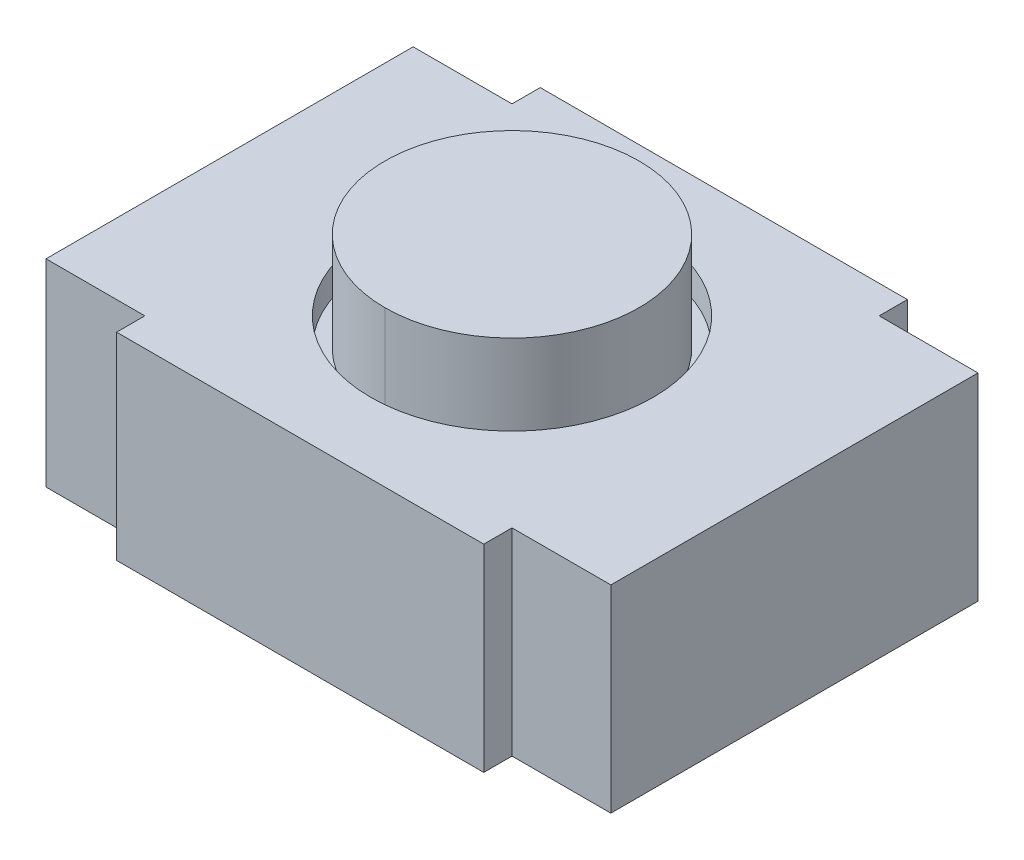
ISO-10303-21;
HEADER;
FILE_DESCRIPTION(('STEP AP214'),'2;1');
FILE_NAME('part.step','',(''),(''),'','','');
FILE_SCHEMA(('AUTOMOTIVE_DESIGN { 1 0 10303 214 1 1 1 1 }'));
ENDSEC;
DATA;
#1=APPLICATION_CONTEXT('core data for automotive mechanical design processes');
#2=APPLICATION_PROTOCOL_DEFINITION('international standard','automotive_design',2000,#1);
#3=PRODUCT_CONTEXT('',#1,'mechanical');
#4=PRODUCT('Part','Part','',(#3));
#5=PRODUCT_RELATED_PRODUCT_CATEGORY('part','',(#4));
#6=PRODUCT_DEFINITION_FORMATION('','',#4);
#7=PRODUCT_DEFINITION_CONTEXT('part definition',#1,'design');
#8=PRODUCT_DEFINITION('design','',#6,#7);
#9=PRODUCT_DEFINITION_SHAPE('','',#8);
#10=(LENGTH_UNIT() NAMED_UNIT(*) SI_UNIT(.MILLI.,.METRE.));
#11=(NAMED_UNIT(*) PLANE_ANGLE_UNIT() SI_UNIT($,.RADIAN.));
#12=(NAMED_UNIT(*) SI_UNIT($,.STERADIAN.) SOLID_ANGLE_UNIT());
#13=UNCERTAINTY_MEASURE_WITH_UNIT(LENGTH_MEASURE(1.E-05),#10,'distance_accuracy_value','');
#14=(GEOMETRIC_REPRESENTATION_CONTEXT(3) GLOBAL_UNCERTAINTY_ASSIGNED_CONTEXT((#13)) GLOBAL_UNIT_ASSIGNED_CONTEXT((#10,
#11,#12)) REPRESENTATION_CONTEXT('',''));
#15=CARTESIAN_POINT('',(0.,0.,0.));
#16=DIRECTION('',(0.,0.,1.));
#17=DIRECTION('',(1.,0.,0.));
#18=AXIS2_PLACEMENT_3D('',#15,#16,#17);
#19=CARTESIAN_POINT('',(0.,-1.2,0.));
#20=DIRECTION('',(0.,1.,0.));
#21=DIRECTION('',(1.,0.,0.));
#22=AXIS2_PLACEMENT_3D('',#19,#20,#21);
#23=PLANE('',#22);
#24=DIRECTION('',(0.,0.,-1.));
#25=VECTOR('',#24,1.);
#26=CARTESIAN_POINT('',(2.,-1.2,-1.3));
#27=LINE('',#26,#25);
#28=CARTESIAN_POINT('',(2.,-1.2,1.3));
#29=VERTEX_POINT('',#28);
#30=CARTESIAN_POINT('',(2.,-1.2,-1.3));
#31=VERTEX_POINT('',#30);
#32=EDGE_CURVE('E26',#29,#31,#27,.T.);
#33=ORIENTED_EDGE('',*,*,#32,.F.);
#34=DIRECTION('',(1.,0.,0.));
#35=VECTOR('',#34,1.);
#36=CARTESIAN_POINT('',(-2.,-1.2,1.3));
#37=LINE('',#36,#35);
#38=CARTESIAN_POINT('',(1.3,-1.2,1.3));
#39=VERTEX_POINT('',#38);
#40=EDGE_CURVE('E11',#39,#29,#37,.T.);
#41=ORIENTED_EDGE('',*,*,#40,.F.);
#42=DIRECTION('',(0.,0.,-1.));
#43=VECTOR('',#42,1.);
#44=CARTESIAN_POINT('',(1.3,-1.2,1.5));
#45=LINE('',#44,#43);
#46=CARTESIAN_POINT('',(1.3,-1.2,1.5));
#47=VERTEX_POINT('',#46);
#48=EDGE_CURVE('E164',#47,#39,#45,.T.);
#49=ORIENTED_EDGE('',*,*,#48,.F.);
#50=DIRECTION('',(1.,0.,0.));
#51=VECTOR('',#50,1.);
#52=CARTESIAN_POINT('',(-1.3,-1.2,1.5));
#53=LINE('',#52,#51);
#54=CARTESIAN_POINT('',(-1.3,-1.2,1.5));
#55=VERTEX_POINT('',#54);
#56=EDGE_CURVE('E126',#55,#47,#53,.T.);
#57=ORIENTED_EDGE('',*,*,#56,.F.);
#58=DIRECTION('',(0.,0.,1.));
#59=VECTOR('',#58,1.);
#60=CARTESIAN_POINT('',(-1.3,-1.2,1.5));
#61=LINE('',#60,#59);
#62=CARTESIAN_POINT('',(-1.3,-1.2,1.3));
#63=VERTEX_POINT('',#62);
#64=EDGE_CURVE('E143',#63,#55,#61,.T.);
#65=ORIENTED_EDGE('',*,*,#64,.F.);
#66=DIRECTION('',(1.,0.,0.));
#67=VECTOR('',#66,1.);
#68=CARTESIAN_POINT('',(-2.,-1.2,1.3));
#69=LINE('',#68,#67);
#70=CARTESIAN_POINT('',(-2.,-1.2,1.3));
#71=VERTEX_POINT('',#70);
#72=EDGE_CURVE('E157',#71,#63,#69,.T.);
#73=ORIENTED_EDGE('',*,*,#72,.F.);
#74=DIRECTION('',(0.,0.,1.));
#75=VECTOR('',#74,1.);
#76=CARTESIAN_POINT('',(-2.,-1.2,-1.3));
#77=LINE('',#76,#75);
#78=CARTESIAN_POINT('',(-2.,-1.2,-1.3));
#79=VERTEX_POINT('',#78);
#80=EDGE_CURVE('E155',#79,#71,#77,.T.);
#81=ORIENTED_EDGE('',*,*,#80,.F.);
#82=DIRECTION('',(-1.,0.,0.));
#83=VECTOR('',#82,1.);
#84=CARTESIAN_POINT('',(-2.,-1.2,-1.3));
#85=LINE('',#84,#83);
#86=CARTESIAN_POINT('',(-1.3,-1.2,-1.3));
#87=VERTEX_POINT('',#86);
#88=EDGE_CURVE('E183',#87,#79,#85,.T.);
#89=ORIENTED_EDGE('',*,*,#88,.F.);
#90=DIRECTION('',(0.,0.,1.));
#91=VECTOR('',#90,1.);
#92=CARTESIAN_POINT('',(-1.3,-1.2,-1.5));
#93=LINE('',#92,#91);
#94=CARTESIAN_POINT('',(-1.3,-1.2,-1.5));
#95=VERTEX_POINT('',#94);
#96=EDGE_CURVE('E200',#95,#87,#93,.T.);
#97=ORIENTED_EDGE('',*,*,#96,.F.);
#98=DIRECTION('',(-1.,0.,0.));
#99=VECTOR('',#98,1.);
#100=CARTESIAN_POINT('',(1.3,-1.2,-1.5));
#101=LINE('',#100,#99);
#102=CARTESIAN_POINT('',(1.3,-1.2,-1.5));
#103=VERTEX_POINT('',#102);
#104=EDGE_CURVE('E190',#103,#95,#101,.T.);
#105=ORIENTED_EDGE('',*,*,#104,.F.);
#106=DIRECTION('',(0.,0.,-1.));
#107=VECTOR('',#106,1.);
#108=CARTESIAN_POINT('',(1.3,-1.2,-1.5));
#109=LINE('',#108,#107);
#110=CARTESIAN_POINT('',(1.3,-1.2,-1.3));
#111=VERTEX_POINT('',#110);
#112=EDGE_CURVE('E176',#111,#103,#109,.T.);
#113=ORIENTED_EDGE('',*,*,#112,.F.);
#114=DIRECTION('',(-1.,0.,0.));
#115=VECTOR('',#114,1.);
#116=CARTESIAN_POINT('',(-2.,-1.2,-1.3));
#117=LINE('',#116,#115);
#118=EDGE_CURVE('E19',#31,#111,#117,.T.);
#119=ORIENTED_EDGE('',*,*,#118,.F.);
#120=EDGE_LOOP('',(#33,#41,#49,#57,#65,#73,#81,#89,#97,#105,#113,#119));
#121=FACE_BOUND('',#120,.T.);
#122=ADVANCED_FACE('F16',(#121),#23,.F.);
#123=CARTESIAN_POINT('',(-2.,-1.2,1.3));
#124=DIRECTION('',(0.,0.,1.));
#125=DIRECTION('',(1.,0.,0.));
#126=AXIS2_PLACEMENT_3D('',#123,#124,#125);
#127=PLANE('',#126);
#128=DIRECTION('',(0.,1.,0.));
#129=VECTOR('',#128,1.);
#130=CARTESIAN_POINT('',(2.,-1.2,1.3));
#131=LINE('',#130,#129);
#132=CARTESIAN_POINT('',(2.,0.2,1.3));
#133=VERTEX_POINT('',#132);
#134=EDGE_CURVE('E205',#29,#133,#131,.T.);
#135=ORIENTED_EDGE('',*,*,#134,.T.);
#136=DIRECTION('',(1.,0.,0.));
#137=VECTOR('',#136,1.);
#138=CARTESIAN_POINT('',(2.,0.2,1.3));
#139=LINE('',#138,#137);
#140=CARTESIAN_POINT('',(1.3,0.2,1.3));
#141=VERTEX_POINT('',#140);
#142=EDGE_CURVE('E125',#141,#133,#139,.T.);
#143=ORIENTED_EDGE('',*,*,#142,.F.);
#144=DIRECTION('',(0.,1.,0.));
#145=VECTOR('',#144,1.);
#146=CARTESIAN_POINT('',(1.3,-3.80768096208106,1.3));
#147=LINE('',#146,#145);
#148=EDGE_CURVE('E222',#39,#141,#147,.T.);
#149=ORIENTED_EDGE('',*,*,#148,.F.);
#150=ORIENTED_EDGE('',*,*,#40,.T.);
#151=EDGE_LOOP('',(#135,#143,#149,#150));
#152=FACE_BOUND('',#151,.T.);
#153=ADVANCED_FACE('F390',(#152),#127,.T.);
#154=CARTESIAN_POINT('',(2.,-1.2,-1.3));
#155=DIRECTION('',(1.,0.,0.));
#156=DIRECTION('',(0.,0.,-1.));
#157=AXIS2_PLACEMENT_3D('',#154,#155,#156);
#158=PLANE('',#157);
#159=DIRECTION('',(0.,1.,0.));
#160=VECTOR('',#159,1.);
#161=CARTESIAN_POINT('',(2.,-1.2,-1.3));
#162=LINE('',#161,#160);
#163=CARTESIAN_POINT('',(2.,0.2,-1.3));
#164=VERTEX_POINT('',#163);
#165=EDGE_CURVE('E201',#31,#164,#162,.T.);
#166=ORIENTED_EDGE('',*,*,#165,.T.);
#167=DIRECTION('',(0.,0.,-1.));
#168=VECTOR('',#167,1.);
#169=CARTESIAN_POINT('',(2.,0.2,-1.3));
#170=LINE('',#169,#168);
#171=EDGE_CURVE('E253',#133,#164,#170,.T.);
#172=ORIENTED_EDGE('',*,*,#171,.F.);
#173=ORIENTED_EDGE('',*,*,#134,.F.);
#174=ORIENTED_EDGE('',*,*,#32,.T.);
#175=EDGE_LOOP('',(#166,#172,#173,#174));
#176=FACE_BOUND('',#175,.T.);
#177=ADVANCED_FACE('F393',(#176),#158,.T.);
#178=CARTESIAN_POINT('',(-2.,-1.2,-1.3));
#179=DIRECTION('',(0.,0.,-1.));
#180=DIRECTION('',(0.,-1.,0.));
#181=AXIS2_PLACEMENT_3D('',#178,#179,#180);
#182=PLANE('',#181);
#183=ORIENTED_EDGE('',*,*,#118,.T.);
#184=DIRECTION('',(0.,-1.,0.));
#185=VECTOR('',#184,1.);
#186=CARTESIAN_POINT('',(1.3,0.2,-1.3));
#187=LINE('',#186,#185);
#188=CARTESIAN_POINT('',(1.3,0.2,-1.3));
#189=VERTEX_POINT('',#188);
#190=EDGE_CURVE('E172',#189,#111,#187,.T.);
#191=ORIENTED_EDGE('',*,*,#190,.F.);
#192=DIRECTION('',(-1.,0.,0.));
#193=VECTOR('',#192,1.);
#194=CARTESIAN_POINT('',(1.3,0.2,-1.3));
#195=LINE('',#194,#193);
#196=EDGE_CURVE('E249',#164,#189,#195,.T.);
#197=ORIENTED_EDGE('',*,*,#196,.F.);
#198=ORIENTED_EDGE('',*,*,#165,.F.);
#199=EDGE_LOOP('',(#183,#191,#197,#198));
#200=FACE_BOUND('',#199,.T.);
#201=ADVANCED_FACE('F364',(#200),#182,.T.);
#202=CARTESIAN_POINT('',(-2.,-1.2,-1.3));
#203=DIRECTION('',(0.,0.,-1.));
#204=DIRECTION('',(0.,-1.,0.));
#205=AXIS2_PLACEMENT_3D('',#202,#203,#204);
#206=PLANE('',#205);
#207=DIRECTION('',(0.,1.,0.));
#208=VECTOR('',#207,1.);
#209=CARTESIAN_POINT('',(-2.,-1.2,-1.3));
#210=LINE('',#209,#208);
#211=CARTESIAN_POINT('',(-2.,0.2,-1.3));
#212=VERTEX_POINT('',#211);
#213=EDGE_CURVE('E152',#79,#212,#210,.T.);
#214=ORIENTED_EDGE('',*,*,#213,.T.);
#215=DIRECTION('',(-1.,0.,0.));
#216=VECTOR('',#215,1.);
#217=CARTESIAN_POINT('',(-1.3,0.2,-1.3));
#218=LINE('',#217,#216);
#219=CARTESIAN_POINT('',(-1.3,0.2,-1.3));
#220=VERTEX_POINT('',#219);
#221=EDGE_CURVE('E194',#220,#212,#218,.T.);
#222=ORIENTED_EDGE('',*,*,#221,.F.);
#223=DIRECTION('',(0.,1.,0.));
#224=VECTOR('',#223,1.);
#225=CARTESIAN_POINT('',(-1.3,-3.80768096208106,-1.3));
#226=LINE('',#225,#224);
#227=EDGE_CURVE('E195',#87,#220,#226,.T.);
#228=ORIENTED_EDGE('',*,*,#227,.F.);
#229=ORIENTED_EDGE('',*,*,#88,.T.);
#230=EDGE_LOOP('',(#214,#222,#228,#229));
#231=FACE_BOUND('',#230,.T.);
#232=ADVANCED_FACE('F377',(#231),#206,.T.);
#233=CARTESIAN_POINT('',(-2.,-1.2,-1.3));
#234=DIRECTION('',(-1.,0.,0.));
#235=DIRECTION('',(0.,1.,0.));
#236=AXIS2_PLACEMENT_3D('',#233,#234,#235);
#237=PLANE('',#236);
#238=DIRECTION('',(0.,1.,0.));
#239=VECTOR('',#238,1.);
#240=CARTESIAN_POINT('',(-2.,-1.2,1.3));
#241=LINE('',#240,#239);
#242=CARTESIAN_POINT('',(-2.,0.2,1.3));
#243=VERTEX_POINT('',#242);
#244=EDGE_CURVE('E156',#71,#243,#241,.T.);
#245=ORIENTED_EDGE('',*,*,#244,.T.);
#246=DIRECTION('',(0.,0.,1.));
#247=VECTOR('',#246,1.);
#248=CARTESIAN_POINT('',(-2.,0.2,-1.3));
#249=LINE('',#248,#247);
#250=EDGE_CURVE('E191',#212,#243,#249,.T.);
#251=ORIENTED_EDGE('',*,*,#250,.F.);
#252=ORIENTED_EDGE('',*,*,#213,.F.);
#253=ORIENTED_EDGE('',*,*,#80,.T.);
#254=EDGE_LOOP('',(#245,#251,#252,#253));
#255=FACE_BOUND('',#254,.T.);
#256=ADVANCED_FACE('F382',(#255),#237,.T.);
#257=CARTESIAN_POINT('',(-2.,-1.2,1.3));
#258=DIRECTION('',(0.,0.,1.));
#259=DIRECTION('',(1.,0.,0.));
#260=AXIS2_PLACEMENT_3D('',#257,#258,#259);
#261=PLANE('',#260);
#262=ORIENTED_EDGE('',*,*,#72,.T.);
#263=DIRECTION('',(0.,-1.,0.));
#264=VECTOR('',#263,1.);
#265=CARTESIAN_POINT('',(-1.3,0.2,1.3));
#266=LINE('',#265,#264);
#267=CARTESIAN_POINT('',(-1.3,0.2,1.3));
#268=VERTEX_POINT('',#267);
#269=EDGE_CURVE('E149',#268,#63,#266,.T.);
#270=ORIENTED_EDGE('',*,*,#269,.F.);
#271=DIRECTION('',(1.,0.,0.));
#272=VECTOR('',#271,1.);
#273=CARTESIAN_POINT('',(-2.,0.2,1.3));
#274=LINE('',#273,#272);
#275=EDGE_CURVE('E135',#243,#268,#274,.T.);
#276=ORIENTED_EDGE('',*,*,#275,.F.);
#277=ORIENTED_EDGE('',*,*,#244,.F.);
#278=EDGE_LOOP('',(#262,#270,#276,#277));
#279=FACE_BOUND('',#278,.T.);
#280=ADVANCED_FACE('F386',(#279),#261,.T.);
#281=CARTESIAN_POINT('',(0.,-1.201,0.));
#282=DIRECTION('',(0.,1.,0.));
#283=DIRECTION('',(0.,0.,1.));
#284=AXIS2_PLACEMENT_3D('',#281,#282,#283);
#285=CYLINDRICAL_SURFACE('',#284,1.);
#286=DIRECTION('',(0.,1.,0.));
#287=VECTOR('',#286,1.);
#288=CARTESIAN_POINT('',(0.,-1.201,-1.));
#289=LINE('',#288,#287);
#290=CARTESIAN_POINT('',(0.,0.,-1.));
#291=VERTEX_POINT('',#290);
#292=CARTESIAN_POINT('',(0.,0.2,-1.));
#293=VERTEX_POINT('',#292);
#294=EDGE_CURVE('E231',#291,#293,#289,.T.);
#295=ORIENTED_EDGE('',*,*,#294,.F.);
#296=CARTESIAN_POINT('',(0.,0.,0.));
#297=DIRECTION('',(0.,-1.,0.));
#298=DIRECTION('',(0.,0.,1.));
#299=AXIS2_PLACEMENT_3D('',#296,#297,#298);
#300=CIRCLE('',#299,1.);
#301=CARTESIAN_POINT('',(0.,0.,1.));
#302=VERTEX_POINT('',#301);
#303=EDGE_CURVE('E170',#291,#302,#300,.T.);
#304=ORIENTED_EDGE('',*,*,#303,.T.);
#305=DIRECTION('',(0.,1.,0.));
#306=VECTOR('',#305,1.);
#307=CARTESIAN_POINT('',(0.,-1.201,1.));
#308=LINE('',#307,#306);
#309=CARTESIAN_POINT('',(0.,0.2,1.));
#310=VERTEX_POINT('',#309);
#311=EDGE_CURVE('E244',#302,#310,#308,.T.);
#312=ORIENTED_EDGE('',*,*,#311,.T.);
#313=CARTESIAN_POINT('',(0.,0.2,0.));
#314=DIRECTION('',(0.,1.,0.));
#315=DIRECTION('',(0.,0.,1.));
#316=AXIS2_PLACEMENT_3D('',#313,#314,#315);
#317=CIRCLE('',#316,1.);
#318=EDGE_CURVE('E161',#310,#293,#317,.T.);
#319=ORIENTED_EDGE('',*,*,#318,.T.);
#320=EDGE_LOOP('',(#295,#304,#312,#319));
#321=FACE_BOUND('',#320,.T.);
#322=ADVANCED_FACE('F459',(#321),#285,.F.);
#323=CARTESIAN_POINT('',(0.,0.2,0.));
#324=DIRECTION('',(0.,1.,0.));
#325=DIRECTION('',(1.,0.,0.));
#326=AXIS2_PLACEMENT_3D('',#323,#324,#325);
#327=PLANE('',#326);
#328=ORIENTED_EDGE('',*,*,#318,.F.);
#329=CARTESIAN_POINT('',(0.,0.2,0.));
#330=DIRECTION('',(0.,1.,0.));
#331=DIRECTION('',(0.,0.,1.));
#332=AXIS2_PLACEMENT_3D('',#329,#330,#331);
#333=CIRCLE('',#332,1.);
#334=EDGE_CURVE('E235',#293,#310,#333,.T.);
#335=ORIENTED_EDGE('',*,*,#334,.F.);
#336=EDGE_LOOP('',(#328,#335));
#337=FACE_BOUND('',#336,.T.);
#338=DIRECTION('',(0.,0.,-1.));
#339=VECTOR('',#338,1.);
#340=CARTESIAN_POINT('',(1.3,0.2,1.3));
#341=LINE('',#340,#339);
#342=CARTESIAN_POINT('',(1.3,0.2,1.5));
#343=VERTEX_POINT('',#342);
#344=EDGE_CURVE('E177',#343,#141,#341,.T.);
#345=ORIENTED_EDGE('',*,*,#344,.T.);
#346=ORIENTED_EDGE('',*,*,#142,.T.);
#347=ORIENTED_EDGE('',*,*,#171,.T.);
#348=ORIENTED_EDGE('',*,*,#196,.T.);
#349=DIRECTION('',(0.,0.,-1.));
#350=VECTOR('',#349,1.);
#351=CARTESIAN_POINT('',(1.3,0.2,-1.5));
#352=LINE('',#351,#350);
#353=CARTESIAN_POINT('',(1.3,0.2,-1.5));
#354=VERTEX_POINT('',#353);
#355=EDGE_CURVE('E182',#189,#354,#352,.T.);
#356=ORIENTED_EDGE('',*,*,#355,.T.);
#357=DIRECTION('',(-1.,0.,0.));
#358=VECTOR('',#357,1.);
#359=CARTESIAN_POINT('',(-1.3,0.2,-1.5));
#360=LINE('',#359,#358);
#361=CARTESIAN_POINT('',(-1.3,0.2,-1.5));
#362=VERTEX_POINT('',#361);
#363=EDGE_CURVE('E237',#354,#362,#360,.T.);
#364=ORIENTED_EDGE('',*,*,#363,.T.);
#365=DIRECTION('',(0.,0.,1.));
#366=VECTOR('',#365,1.);
#367=CARTESIAN_POINT('',(-1.3,0.2,-1.5));
#368=LINE('',#367,#366);
#369=EDGE_CURVE('E199',#362,#220,#368,.T.);
#370=ORIENTED_EDGE('',*,*,#369,.T.);
#371=ORIENTED_EDGE('',*,*,#221,.T.);
#372=ORIENTED_EDGE('',*,*,#250,.T.);
#373=ORIENTED_EDGE('',*,*,#275,.T.);
#374=DIRECTION('',(0.,0.,1.));
#375=VECTOR('',#374,1.);
#376=CARTESIAN_POINT('',(-1.3,0.2,1.3));
#377=LINE('',#376,#375);
#378=CARTESIAN_POINT('',(-1.3,0.2,1.5));
#379=VERTEX_POINT('',#378);
#380=EDGE_CURVE('E130',#268,#379,#377,.T.);
#381=ORIENTED_EDGE('',*,*,#380,.T.);
#382=DIRECTION('',(1.,0.,0.));
#383=VECTOR('',#382,1.);
#384=CARTESIAN_POINT('',(-1.3,0.2,1.5));
#385=LINE('',#384,#383);
#386=EDGE_CURVE('E112',#379,#343,#385,.T.);
#387=ORIENTED_EDGE('',*,*,#386,.T.);
#388=EDGE_LOOP('',(#345,#346,#347,#348,#356,#364,#370,#371,#372,#373,#381,#387));
#389=FACE_BOUND('',#388,.T.);
#390=ADVANCED_FACE('F131',(#337,#389),#327,.T.);
#391=CARTESIAN_POINT('',(-1.3,0.2,1.5));
#392=DIRECTION('',(0.,0.,-1.));
#393=DIRECTION('',(0.,-1.,0.));
#394=AXIS2_PLACEMENT_3D('',#391,#392,#393);
#395=PLANE('',#394);
#396=DIRECTION('',(0.,-1.,0.));
#397=VECTOR('',#396,1.);
#398=CARTESIAN_POINT('',(-1.3,0.2,1.5));
#399=LINE('',#398,#397);
#400=EDGE_CURVE('E117',#379,#55,#399,.T.);
#401=ORIENTED_EDGE('',*,*,#400,.T.);
#402=ORIENTED_EDGE('',*,*,#56,.T.);
#403=DIRECTION('',(0.,-1.,0.));
#404=VECTOR('',#403,1.);
#405=CARTESIAN_POINT('',(1.3,0.2,1.5));
#406=LINE('',#405,#404);
#407=EDGE_CURVE('E120',#343,#47,#406,.T.);
#408=ORIENTED_EDGE('',*,*,#407,.F.);
#409=ORIENTED_EDGE('',*,*,#386,.F.);
#410=EDGE_LOOP('',(#401,#402,#408,#409));
#411=FACE_BOUND('',#410,.T.);
#412=ADVANCED_FACE('F114',(#411),#395,.F.);
#413=CARTESIAN_POINT('',(-1.3,0.2,1.3));
#414=DIRECTION('',(1.,0.,0.));
#415=DIRECTION('',(0.,0.,1.));
#416=AXIS2_PLACEMENT_3D('',#413,#414,#415);
#417=PLANE('',#416);
#418=ORIENTED_EDGE('',*,*,#269,.T.);
#419=ORIENTED_EDGE('',*,*,#64,.T.);
#420=ORIENTED_EDGE('',*,*,#400,.F.);
#421=ORIENTED_EDGE('',*,*,#380,.F.);
#422=EDGE_LOOP('',(#418,#419,#420,#421));
#423=FACE_BOUND('',#422,.T.);
#424=ADVANCED_FACE('F141',(#423),#417,.F.);
#425=CARTESIAN_POINT('',(-1.3,0.2,-1.5));
#426=DIRECTION('',(1.,0.,0.));
#427=DIRECTION('',(0.,0.,-1.));
#428=AXIS2_PLACEMENT_3D('',#425,#426,#427);
#429=PLANE('',#428);
#430=DIRECTION('',(0.,-1.,0.));
#431=VECTOR('',#430,1.);
#432=CARTESIAN_POINT('',(-1.3,0.2,-1.5));
#433=LINE('',#432,#431);
#434=EDGE_CURVE('E216',#362,#95,#433,.T.);
#435=ORIENTED_EDGE('',*,*,#434,.T.);
#436=ORIENTED_EDGE('',*,*,#96,.T.);
#437=ORIENTED_EDGE('',*,*,#227,.T.);
#438=ORIENTED_EDGE('',*,*,#369,.F.);
#439=EDGE_LOOP('',(#435,#436,#437,#438));
#440=FACE_BOUND('',#439,.T.);
#441=ADVANCED_FACE('F375',(#440),#429,.F.);
#442=CARTESIAN_POINT('',(-1.3,0.2,-1.5));
#443=DIRECTION('',(0.,0.,1.));
#444=DIRECTION('',(1.,0.,0.));
#445=AXIS2_PLACEMENT_3D('',#442,#443,#444);
#446=PLANE('',#445);
#447=DIRECTION('',(0.,-1.,0.));
#448=VECTOR('',#447,1.);
#449=CARTESIAN_POINT('',(1.3,0.2,-1.5));
#450=LINE('',#449,#448);
#451=EDGE_CURVE('E178',#354,#103,#450,.T.);
#452=ORIENTED_EDGE('',*,*,#451,.T.);
#453=ORIENTED_EDGE('',*,*,#104,.T.);
#454=ORIENTED_EDGE('',*,*,#434,.F.);
#455=ORIENTED_EDGE('',*,*,#363,.F.);
#456=EDGE_LOOP('',(#452,#453,#454,#455));
#457=FACE_BOUND('',#456,.T.);
#458=ADVANCED_FACE('F371',(#457),#446,.F.);
#459=CARTESIAN_POINT('',(1.3,0.2,-1.5));
#460=DIRECTION('',(-1.,0.,0.));
#461=DIRECTION('',(0.,1.,0.));
#462=AXIS2_PLACEMENT_3D('',#459,#460,#461);
#463=PLANE('',#462);
#464=ORIENTED_EDGE('',*,*,#190,.T.);
#465=ORIENTED_EDGE('',*,*,#112,.T.);
#466=ORIENTED_EDGE('',*,*,#451,.F.);
#467=ORIENTED_EDGE('',*,*,#355,.F.);
#468=EDGE_LOOP('',(#464,#465,#466,#467));
#469=FACE_BOUND('',#468,.T.);
#470=ADVANCED_FACE('F363',(#469),#463,.F.);
#471=CARTESIAN_POINT('',(1.3,0.2,1.3));
#472=DIRECTION('',(-1.,0.,0.));
#473=DIRECTION('',(0.,0.,1.));
#474=AXIS2_PLACEMENT_3D('',#471,#472,#473);
#475=PLANE('',#474);
#476=ORIENTED_EDGE('',*,*,#407,.T.);
#477=ORIENTED_EDGE('',*,*,#48,.T.);
#478=ORIENTED_EDGE('',*,*,#148,.T.);
#479=ORIENTED_EDGE('',*,*,#344,.F.);
#480=EDGE_LOOP('',(#476,#477,#478,#479));
#481=FACE_BOUND('',#480,.T.);
#482=ADVANCED_FACE('F389',(#481),#475,.F.);
#483=CARTESIAN_POINT('',(0.,0.7,0.));
#484=DIRECTION('',(0.,1.,0.));
#485=DIRECTION('',(1.,0.,0.));
#486=AXIS2_PLACEMENT_3D('',#483,#484,#485);
#487=PLANE('',#486);
#488=CARTESIAN_POINT('',(0.,0.7,0.));
#489=DIRECTION('',(0.,1.,0.));
#490=DIRECTION('',(0.,0.,1.));
#491=AXIS2_PLACEMENT_3D('',#488,#489,#490);
#492=CIRCLE('',#491,0.9);
#493=CARTESIAN_POINT('',(0.,0.7,-0.9));
#494=VERTEX_POINT('',#493);
#495=CARTESIAN_POINT('',(0.,0.7,0.9));
#496=VERTEX_POINT('',#495);
#497=EDGE_CURVE('E165',#494,#496,#492,.T.);
#498=ORIENTED_EDGE('',*,*,#497,.T.);
#499=CARTESIAN_POINT('',(0.,0.7,0.));
#500=DIRECTION('',(0.,1.,0.));
#501=DIRECTION('',(0.,0.,1.));
#502=AXIS2_PLACEMENT_3D('',#499,#500,#501);
#503=CIRCLE('',#502,0.9);
#504=EDGE_CURVE('E248',#496,#494,#503,.T.);
#505=ORIENTED_EDGE('',*,*,#504,.T.);
#506=EDGE_LOOP('',(#498,#505));
#507=FACE_BOUND('',#506,.T.);
#508=ADVANCED_FACE('F546',(#507),#487,.T.);
#509=CARTESIAN_POINT('',(0.,3.74558441227157,0.));
#510=DIRECTION('',(0.,-1.,0.));
#511=DIRECTION('',(0.,0.,-1.));
#512=AXIS2_PLACEMENT_3D('',#509,#510,#511);
#513=CYLINDRICAL_SURFACE('',#512,0.9);
#514=DIRECTION('',(0.,-1.,0.));
#515=VECTOR('',#514,1.);
#516=CARTESIAN_POINT('',(0.,3.74558441227157,0.9));
#517=LINE('',#516,#515);
#518=CARTESIAN_POINT('',(0.,0.,0.9));
#519=VERTEX_POINT('',#518);
#520=EDGE_CURVE('E263',#496,#519,#517,.T.);
#521=ORIENTED_EDGE('',*,*,#520,.F.);
#522=ORIENTED_EDGE('',*,*,#497,.F.);
#523=DIRECTION('',(0.,-1.,0.));
#524=VECTOR('',#523,1.);
#525=CARTESIAN_POINT('',(0.,3.74558441227157,-0.9));
#526=LINE('',#525,#524);
#527=CARTESIAN_POINT('',(0.,0.,-0.9));
#528=VERTEX_POINT('',#527);
#529=EDGE_CURVE('E166',#494,#528,#526,.T.);
#530=ORIENTED_EDGE('',*,*,#529,.T.);
#531=CARTESIAN_POINT('',(0.,0.,0.));
#532=DIRECTION('',(0.,1.,0.));
#533=DIRECTION('',(0.,0.,1.));
#534=AXIS2_PLACEMENT_3D('',#531,#532,#533);
#535=CIRCLE('',#534,0.9);
#536=EDGE_CURVE('E209',#528,#519,#535,.T.);
#537=ORIENTED_EDGE('',*,*,#536,.T.);
#538=EDGE_LOOP('',(#521,#522,#530,#537));
#539=FACE_BOUND('',#538,.T.);
#540=ADVANCED_FACE('F310',(#539),#513,.T.);
#541=CARTESIAN_POINT('',(0.,0.,0.));
#542=DIRECTION('',(0.,1.,0.));
#543=DIRECTION('',(1.,0.,0.));
#544=AXIS2_PLACEMENT_3D('',#541,#542,#543);
#545=PLANE('',#544);
#546=ORIENTED_EDGE('',*,*,#536,.F.);
#547=CARTESIAN_POINT('',(0.,0.,0.));
#548=DIRECTION('',(0.,1.,0.));
#549=DIRECTION('',(0.,0.,1.));
#550=AXIS2_PLACEMENT_3D('',#547,#548,#549);
#551=CIRCLE('',#550,0.9);
#552=EDGE_CURVE('E171',#519,#528,#551,.T.);
#553=ORIENTED_EDGE('',*,*,#552,.F.);
#554=EDGE_LOOP('',(#546,#553));
#555=FACE_BOUND('',#554,.T.);
#556=CARTESIAN_POINT('',(0.,0.,0.));
#557=DIRECTION('',(0.,-1.,0.));
#558=DIRECTION('',(0.,0.,1.));
#559=AXIS2_PLACEMENT_3D('',#556,#557,#558);
#560=CIRCLE('',#559,1.);
#561=EDGE_CURVE('E236',#302,#291,#560,.T.);
#562=ORIENTED_EDGE('',*,*,#561,.F.);
#563=ORIENTED_EDGE('',*,*,#303,.F.);
#564=EDGE_LOOP('',(#562,#563));
#565=FACE_BOUND('',#564,.T.);
#566=ADVANCED_FACE('F562',(#555,#565),#545,.T.);
#567=CARTESIAN_POINT('',(0.,3.74558441227157,0.));
#568=DIRECTION('',(0.,-1.,0.));
#569=DIRECTION('',(0.,0.,-1.));
#570=AXIS2_PLACEMENT_3D('',#567,#568,#569);
#571=CYLINDRICAL_SURFACE('',#570,0.9);
#572=ORIENTED_EDGE('',*,*,#504,.F.);
#573=ORIENTED_EDGE('',*,*,#520,.T.);
#574=ORIENTED_EDGE('',*,*,#552,.T.);
#575=ORIENTED_EDGE('',*,*,#529,.F.);
#576=EDGE_LOOP('',(#572,#573,#574,#575));
#577=FACE_BOUND('',#576,.T.);
#578=ADVANCED_FACE('F306',(#577),#571,.T.);
#579=CARTESIAN_POINT('',(0.,-1.201,0.));
#580=DIRECTION('',(0.,1.,0.));
#581=DIRECTION('',(0.,0.,1.));
#582=AXIS2_PLACEMENT_3D('',#579,#580,#581);
#583=CYLINDRICAL_SURFACE('',#582,1.);
#584=ORIENTED_EDGE('',*,*,#561,.T.);
#585=ORIENTED_EDGE('',*,*,#294,.T.);
#586=ORIENTED_EDGE('',*,*,#334,.T.);
#587=ORIENTED_EDGE('',*,*,#311,.F.);
#588=EDGE_LOOP('',(#584,#585,#586,#587));
#589=FACE_BOUND('',#588,.T.);
#590=ADVANCED_FACE('F579',(#589),#583,.F.);
#591=CLOSED_SHELL('',(#122,#153,#177,#201,#232,#256,#280,#322,#390,#412,#424,#441,#458,#470,
#482,#508,#540,#566,#578,#590));
#592=MANIFOLD_SOLID_BREP('B1',#591);
#593=ADVANCED_BREP_SHAPE_REPRESENTATION('',(#18,#592),#14);
#594=SHAPE_DEFINITION_REPRESENTATION(#9,#593);
ENDSEC;
END-ISO-10303-21;
